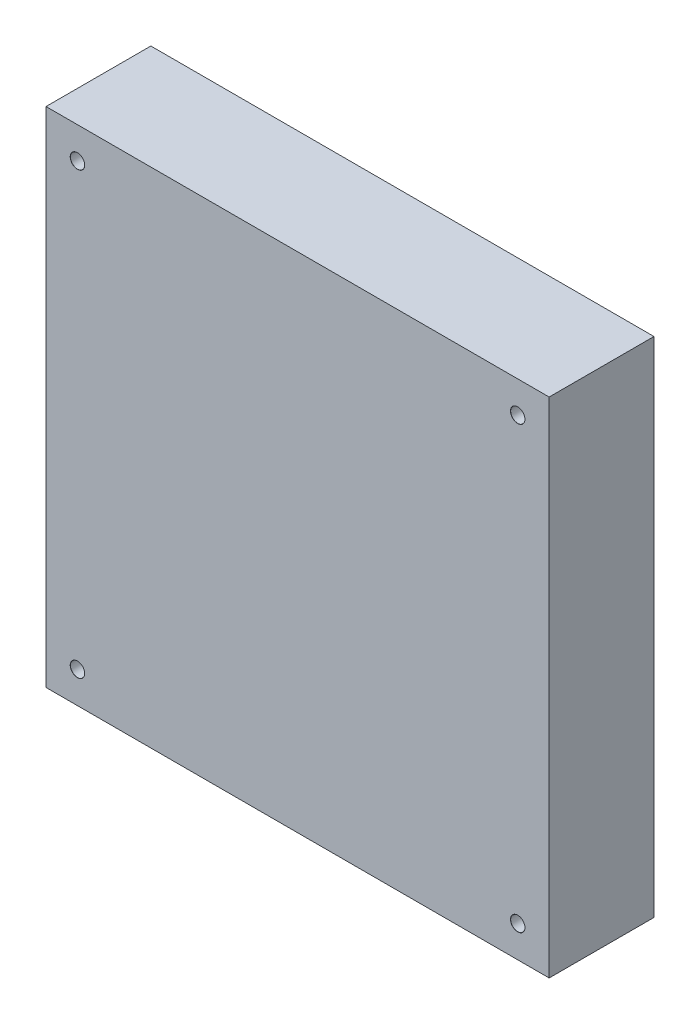
ISO-10303-21;
HEADER;
FILE_DESCRIPTION(('STEP AP214'),'2;1');
FILE_NAME('part.step','',(''),(''),'','','');
FILE_SCHEMA(('AUTOMOTIVE_DESIGN { 1 0 10303 214 1 1 1 1 }'));
ENDSEC;
DATA;
#1=APPLICATION_CONTEXT('core data for automotive mechanical design processes');
#2=APPLICATION_PROTOCOL_DEFINITION('international standard','automotive_design',2000,#1);
#3=PRODUCT_CONTEXT('',#1,'mechanical');
#4=PRODUCT('Part','Part','',(#3));
#5=PRODUCT_RELATED_PRODUCT_CATEGORY('part','',(#4));
#6=PRODUCT_DEFINITION_FORMATION('','',#4);
#7=PRODUCT_DEFINITION_CONTEXT('part definition',#1,'design');
#8=PRODUCT_DEFINITION('design','',#6,#7);
#9=PRODUCT_DEFINITION_SHAPE('','',#8);
#10=(LENGTH_UNIT() NAMED_UNIT(*) SI_UNIT(.MILLI.,.METRE.));
#11=(NAMED_UNIT(*) PLANE_ANGLE_UNIT() SI_UNIT($,.RADIAN.));
#12=(NAMED_UNIT(*) SI_UNIT($,.STERADIAN.) SOLID_ANGLE_UNIT());
#13=UNCERTAINTY_MEASURE_WITH_UNIT(LENGTH_MEASURE(1.E-05),#10,'distance_accuracy_value','');
#14=(GEOMETRIC_REPRESENTATION_CONTEXT(3) GLOBAL_UNCERTAINTY_ASSIGNED_CONTEXT((#13)) GLOBAL_UNIT_ASSIGNED_CONTEXT((#10,
#11,#12)) REPRESENTATION_CONTEXT('',''));
#15=CARTESIAN_POINT('',(0.,0.,0.));
#16=DIRECTION('',(0.,0.,1.));
#17=DIRECTION('',(1.,0.,0.));
#18=AXIS2_PLACEMENT_3D('',#15,#16,#17);
#19=CARTESIAN_POINT('',(60.,60.,25.));
#20=DIRECTION('',(-1.,0.,0.));
#21=DIRECTION('',(0.,-1.,0.));
#22=AXIS2_PLACEMENT_3D('',#19,#20,#21);
#23=PLANE('',#22);
#24=DIRECTION('',(0.,1.,0.));
#25=VECTOR('',#24,1.);
#26=CARTESIAN_POINT('',(60.,60.,0.));
#27=LINE('',#26,#25);
#28=CARTESIAN_POINT('',(60.,-60.,0.));
#29=VERTEX_POINT('',#28);
#30=CARTESIAN_POINT('',(60.,60.,0.));
#31=VERTEX_POINT('',#30);
#32=EDGE_CURVE('E106',#29,#31,#27,.T.);
#33=ORIENTED_EDGE('',*,*,#32,.T.);
#34=DIRECTION('',(0.,0.,-1.));
#35=VECTOR('',#34,1.);
#36=CARTESIAN_POINT('',(60.,60.,25.));
#37=LINE('',#36,#35);
#38=CARTESIAN_POINT('',(60.,60.,25.));
#39=VERTEX_POINT('',#38);
#40=EDGE_CURVE('E11',#39,#31,#37,.T.);
#41=ORIENTED_EDGE('',*,*,#40,.F.);
#42=DIRECTION('',(0.,1.,0.));
#43=VECTOR('',#42,1.);
#44=CARTESIAN_POINT('',(60.,60.,25.));
#45=LINE('',#44,#43);
#46=CARTESIAN_POINT('',(60.,-60.,25.));
#47=VERTEX_POINT('',#46);
#48=EDGE_CURVE('E94',#47,#39,#45,.T.);
#49=ORIENTED_EDGE('',*,*,#48,.F.);
#50=DIRECTION('',(0.,0.,-1.));
#51=VECTOR('',#50,1.);
#52=CARTESIAN_POINT('',(60.,-60.,25.));
#53=LINE('',#52,#51);
#54=EDGE_CURVE('E102',#47,#29,#53,.T.);
#55=ORIENTED_EDGE('',*,*,#54,.T.);
#56=EDGE_LOOP('',(#33,#41,#49,#55));
#57=FACE_BOUND('',#56,.T.);
#58=ADVANCED_FACE('F43',(#57),#23,.F.);
#59=CARTESIAN_POINT('',(-60.,60.,25.));
#60=DIRECTION('',(0.,-1.,0.));
#61=DIRECTION('',(0.,0.,-1.));
#62=AXIS2_PLACEMENT_3D('',#59,#60,#61);
#63=PLANE('',#62);
#64=DIRECTION('',(-1.,0.,0.));
#65=VECTOR('',#64,1.);
#66=CARTESIAN_POINT('',(-60.,60.,0.));
#67=LINE('',#66,#65);
#68=CARTESIAN_POINT('',(-60.,60.,0.));
#69=VERTEX_POINT('',#68);
#70=EDGE_CURVE('E98',#31,#69,#67,.T.);
#71=ORIENTED_EDGE('',*,*,#70,.T.);
#72=DIRECTION('',(0.,0.,-1.));
#73=VECTOR('',#72,1.);
#74=CARTESIAN_POINT('',(-60.,60.,25.));
#75=LINE('',#74,#73);
#76=CARTESIAN_POINT('',(-60.,60.,25.));
#77=VERTEX_POINT('',#76);
#78=EDGE_CURVE('E51',#77,#69,#75,.T.);
#79=ORIENTED_EDGE('',*,*,#78,.F.);
#80=DIRECTION('',(-1.,0.,0.));
#81=VECTOR('',#80,1.);
#82=CARTESIAN_POINT('',(-60.,60.,25.));
#83=LINE('',#82,#81);
#84=EDGE_CURVE('E89',#39,#77,#83,.T.);
#85=ORIENTED_EDGE('',*,*,#84,.F.);
#86=ORIENTED_EDGE('',*,*,#40,.T.);
#87=EDGE_LOOP('',(#71,#79,#85,#86));
#88=FACE_BOUND('',#87,.T.);
#89=ADVANCED_FACE('F97',(#88),#63,.F.);
#90=CARTESIAN_POINT('',(-60.,60.,25.));
#91=DIRECTION('',(1.,0.,0.));
#92=DIRECTION('',(0.,1.,0.));
#93=AXIS2_PLACEMENT_3D('',#90,#91,#92);
#94=PLANE('',#93);
#95=DIRECTION('',(0.,-1.,0.));
#96=VECTOR('',#95,1.);
#97=CARTESIAN_POINT('',(-60.,60.,0.));
#98=LINE('',#97,#96);
#99=CARTESIAN_POINT('',(-60.,-60.,0.));
#100=VERTEX_POINT('',#99);
#101=EDGE_CURVE('E76',#69,#100,#98,.T.);
#102=ORIENTED_EDGE('',*,*,#101,.T.);
#103=DIRECTION('',(0.,0.,-1.));
#104=VECTOR('',#103,1.);
#105=CARTESIAN_POINT('',(-60.,-60.,25.));
#106=LINE('',#105,#104);
#107=CARTESIAN_POINT('',(-60.,-60.,25.));
#108=VERTEX_POINT('',#107);
#109=EDGE_CURVE('E99',#108,#100,#106,.T.);
#110=ORIENTED_EDGE('',*,*,#109,.F.);
#111=DIRECTION('',(0.,-1.,0.));
#112=VECTOR('',#111,1.);
#113=CARTESIAN_POINT('',(-60.,60.,25.));
#114=LINE('',#113,#112);
#115=EDGE_CURVE('E92',#77,#108,#114,.T.);
#116=ORIENTED_EDGE('',*,*,#115,.F.);
#117=ORIENTED_EDGE('',*,*,#78,.T.);
#118=EDGE_LOOP('',(#102,#110,#116,#117));
#119=FACE_BOUND('',#118,.T.);
#120=ADVANCED_FACE('F100',(#119),#94,.F.);
#121=CARTESIAN_POINT('',(-60.,-60.,25.));
#122=DIRECTION('',(0.,1.,0.));
#123=DIRECTION('',(0.,0.,1.));
#124=AXIS2_PLACEMENT_3D('',#121,#122,#123);
#125=PLANE('',#124);
#126=DIRECTION('',(1.,0.,0.));
#127=VECTOR('',#126,1.);
#128=CARTESIAN_POINT('',(-60.,-60.,0.));
#129=LINE('',#128,#127);
#130=EDGE_CURVE('E82',#100,#29,#129,.T.);
#131=ORIENTED_EDGE('',*,*,#130,.T.);
#132=ORIENTED_EDGE('',*,*,#54,.F.);
#133=DIRECTION('',(1.,0.,0.));
#134=VECTOR('',#133,1.);
#135=CARTESIAN_POINT('',(-60.,-60.,25.));
#136=LINE('',#135,#134);
#137=EDGE_CURVE('E59',#108,#47,#136,.T.);
#138=ORIENTED_EDGE('',*,*,#137,.F.);
#139=ORIENTED_EDGE('',*,*,#109,.T.);
#140=EDGE_LOOP('',(#131,#132,#138,#139));
#141=FACE_BOUND('',#140,.T.);
#142=ADVANCED_FACE('F114',(#141),#125,.F.);
#143=CARTESIAN_POINT('',(0.,0.,25.));
#144=DIRECTION('',(0.,0.,1.));
#145=DIRECTION('',(1.,0.,0.));
#146=AXIS2_PLACEMENT_3D('',#143,#144,#145);
#147=PLANE('',#146);
#148=CARTESIAN_POINT('',(-52.5,52.5,25.));
#149=DIRECTION('',(0.,0.,1.));
#150=DIRECTION('',(1.,0.,0.));
#151=AXIS2_PLACEMENT_3D('',#148,#149,#150);
#152=CIRCLE('',#151,1.725);
#153=CARTESIAN_POINT('',(-50.775,52.5,25.));
#154=VERTEX_POINT('',#153);
#155=EDGE_CURVE('E152',#154,#154,#152,.T.);
#156=ORIENTED_EDGE('',*,*,#155,.F.);
#157=EDGE_LOOP('',(#156));
#158=FACE_BOUND('',#157,.T.);
#159=CARTESIAN_POINT('',(52.5,52.5,25.));
#160=DIRECTION('',(0.,0.,1.));
#161=DIRECTION('',(1.,0.,0.));
#162=AXIS2_PLACEMENT_3D('',#159,#160,#161);
#163=CIRCLE('',#162,1.725);
#164=CARTESIAN_POINT('',(54.225,52.5,25.));
#165=VERTEX_POINT('',#164);
#166=EDGE_CURVE('E143',#165,#165,#163,.T.);
#167=ORIENTED_EDGE('',*,*,#166,.F.);
#168=EDGE_LOOP('',(#167));
#169=FACE_BOUND('',#168,.T.);
#170=CARTESIAN_POINT('',(52.5,-52.5,25.));
#171=DIRECTION('',(0.,0.,1.));
#172=DIRECTION('',(1.,0.,0.));
#173=AXIS2_PLACEMENT_3D('',#170,#171,#172);
#174=CIRCLE('',#173,1.725);
#175=CARTESIAN_POINT('',(54.225,-52.5,25.));
#176=VERTEX_POINT('',#175);
#177=EDGE_CURVE('E134',#176,#176,#174,.T.);
#178=ORIENTED_EDGE('',*,*,#177,.F.);
#179=EDGE_LOOP('',(#178));
#180=FACE_BOUND('',#179,.T.);
#181=CARTESIAN_POINT('',(-52.5,-52.5,25.));
#182=DIRECTION('',(0.,0.,1.));
#183=DIRECTION('',(1.,0.,0.));
#184=AXIS2_PLACEMENT_3D('',#181,#182,#183);
#185=CIRCLE('',#184,1.725);
#186=CARTESIAN_POINT('',(-50.775,-52.5,25.));
#187=VERTEX_POINT('',#186);
#188=EDGE_CURVE('E125',#187,#187,#185,.T.);
#189=ORIENTED_EDGE('',*,*,#188,.F.);
#190=EDGE_LOOP('',(#189));
#191=FACE_BOUND('',#190,.T.);
#192=ORIENTED_EDGE('',*,*,#48,.T.);
#193=ORIENTED_EDGE('',*,*,#84,.T.);
#194=ORIENTED_EDGE('',*,*,#115,.T.);
#195=ORIENTED_EDGE('',*,*,#137,.T.);
#196=EDGE_LOOP('',(#192,#193,#194,#195));
#197=FACE_BOUND('',#196,.T.);
#198=ADVANCED_FACE('F90',(#158,#169,#180,#191,#197),#147,.T.);
#199=CARTESIAN_POINT('',(0.,0.,0.));
#200=DIRECTION('',(0.,0.,1.));
#201=DIRECTION('',(1.,0.,0.));
#202=AXIS2_PLACEMENT_3D('',#199,#200,#201);
#203=PLANE('',#202);
#204=CARTESIAN_POINT('',(-52.5,52.5,0.));
#205=DIRECTION('',(0.,0.,1.));
#206=DIRECTION('',(1.,0.,0.));
#207=AXIS2_PLACEMENT_3D('',#204,#205,#206);
#208=CIRCLE('',#207,1.7);
#209=CARTESIAN_POINT('',(-50.8,52.5,0.));
#210=VERTEX_POINT('',#209);
#211=EDGE_CURVE('E146',#210,#210,#208,.T.);
#212=ORIENTED_EDGE('',*,*,#211,.T.);
#213=EDGE_LOOP('',(#212));
#214=FACE_BOUND('',#213,.T.);
#215=CARTESIAN_POINT('',(52.5,52.5,0.));
#216=DIRECTION('',(0.,0.,1.));
#217=DIRECTION('',(1.,0.,0.));
#218=AXIS2_PLACEMENT_3D('',#215,#216,#217);
#219=CIRCLE('',#218,1.7);
#220=CARTESIAN_POINT('',(54.2,52.5,0.));
#221=VERTEX_POINT('',#220);
#222=EDGE_CURVE('E137',#221,#221,#219,.T.);
#223=ORIENTED_EDGE('',*,*,#222,.T.);
#224=EDGE_LOOP('',(#223));
#225=FACE_BOUND('',#224,.T.);
#226=CARTESIAN_POINT('',(52.5,-52.5,0.));
#227=DIRECTION('',(0.,0.,1.));
#228=DIRECTION('',(1.,0.,0.));
#229=AXIS2_PLACEMENT_3D('',#226,#227,#228);
#230=CIRCLE('',#229,1.7);
#231=CARTESIAN_POINT('',(54.2,-52.5,0.));
#232=VERTEX_POINT('',#231);
#233=EDGE_CURVE('E128',#232,#232,#230,.T.);
#234=ORIENTED_EDGE('',*,*,#233,.T.);
#235=EDGE_LOOP('',(#234));
#236=FACE_BOUND('',#235,.T.);
#237=CARTESIAN_POINT('',(-52.5,-52.5,0.));
#238=DIRECTION('',(0.,0.,1.));
#239=DIRECTION('',(1.,0.,0.));
#240=AXIS2_PLACEMENT_3D('',#237,#238,#239);
#241=CIRCLE('',#240,1.7);
#242=CARTESIAN_POINT('',(-50.8,-52.5,0.));
#243=VERTEX_POINT('',#242);
#244=EDGE_CURVE('E109',#243,#243,#241,.T.);
#245=ORIENTED_EDGE('',*,*,#244,.T.);
#246=EDGE_LOOP('',(#245));
#247=FACE_BOUND('',#246,.T.);
#248=ORIENTED_EDGE('',*,*,#32,.F.);
#249=ORIENTED_EDGE('',*,*,#130,.F.);
#250=ORIENTED_EDGE('',*,*,#101,.F.);
#251=ORIENTED_EDGE('',*,*,#70,.F.);
#252=EDGE_LOOP('',(#248,#249,#250,#251));
#253=FACE_BOUND('',#252,.T.);
#254=ADVANCED_FACE('F117',(#214,#225,#236,#247,#253),#203,.F.);
#255=CARTESIAN_POINT('',(-52.5,-52.5,25.));
#256=DIRECTION('',(0.,0.,1.));
#257=DIRECTION('',(1.,0.,0.));
#258=AXIS2_PLACEMENT_3D('',#255,#256,#257);
#259=CYLINDRICAL_SURFACE('',#258,1.7);
#260=ORIENTED_EDGE('',*,*,#244,.F.);
#261=EDGE_LOOP('',(#260));
#262=FACE_BOUND('',#261,.T.);
#263=CARTESIAN_POINT('',(-52.5,-52.5,24.9790225092206));
#264=DIRECTION('',(0.,0.,1.));
#265=DIRECTION('',(1.,0.,0.));
#266=AXIS2_PLACEMENT_3D('',#263,#264,#265);
#267=CIRCLE('',#266,1.7);
#268=CARTESIAN_POINT('',(-50.8,-52.5,24.9790225092206));
#269=VERTEX_POINT('',#268);
#270=EDGE_CURVE('E122',#269,#269,#267,.T.);
#271=ORIENTED_EDGE('',*,*,#270,.T.);
#272=EDGE_LOOP('',(#271));
#273=FACE_BOUND('',#272,.T.);
#274=ADVANCED_FACE('F170',(#262,#273),#259,.F.);
#275=CARTESIAN_POINT('',(-52.5,-52.5,25.));
#276=DIRECTION('',(0.,0.,1.));
#277=DIRECTION('',(1.,0.,0.));
#278=AXIS2_PLACEMENT_3D('',#275,#276,#277);
#279=CONICAL_SURFACE('',#278,1.725,0.87266462599709);
#280=ORIENTED_EDGE('',*,*,#270,.F.);
#281=EDGE_LOOP('',(#280));
#282=FACE_BOUND('',#281,.T.);
#283=ORIENTED_EDGE('',*,*,#188,.T.);
#284=EDGE_LOOP('',(#283));
#285=FACE_BOUND('',#284,.T.);
#286=ADVANCED_FACE('F167',(#282,#285),#279,.F.);
#287=CARTESIAN_POINT('',(52.5,-52.5,25.));
#288=DIRECTION('',(0.,0.,1.));
#289=DIRECTION('',(1.,0.,0.));
#290=AXIS2_PLACEMENT_3D('',#287,#288,#289);
#291=CYLINDRICAL_SURFACE('',#290,1.7);
#292=ORIENTED_EDGE('',*,*,#233,.F.);
#293=EDGE_LOOP('',(#292));
#294=FACE_BOUND('',#293,.T.);
#295=CARTESIAN_POINT('',(52.5,-52.5,24.9790225092206));
#296=DIRECTION('',(0.,0.,1.));
#297=DIRECTION('',(1.,0.,0.));
#298=AXIS2_PLACEMENT_3D('',#295,#296,#297);
#299=CIRCLE('',#298,1.7);
#300=CARTESIAN_POINT('',(54.2,-52.5,24.9790225092206));
#301=VERTEX_POINT('',#300);
#302=EDGE_CURVE('E131',#301,#301,#299,.T.);
#303=ORIENTED_EDGE('',*,*,#302,.T.);
#304=EDGE_LOOP('',(#303));
#305=FACE_BOUND('',#304,.T.);
#306=ADVANCED_FACE('F169',(#294,#305),#291,.F.);
#307=CARTESIAN_POINT('',(52.5,-52.5,25.));
#308=DIRECTION('',(0.,0.,1.));
#309=DIRECTION('',(1.,0.,0.));
#310=AXIS2_PLACEMENT_3D('',#307,#308,#309);
#311=CONICAL_SURFACE('',#310,1.725,0.87266462599709);
#312=ORIENTED_EDGE('',*,*,#302,.F.);
#313=EDGE_LOOP('',(#312));
#314=FACE_BOUND('',#313,.T.);
#315=ORIENTED_EDGE('',*,*,#177,.T.);
#316=EDGE_LOOP('',(#315));
#317=FACE_BOUND('',#316,.T.);
#318=ADVANCED_FACE('F177',(#314,#317),#311,.F.);
#319=CARTESIAN_POINT('',(52.5,52.5,25.));
#320=DIRECTION('',(0.,0.,1.));
#321=DIRECTION('',(1.,0.,0.));
#322=AXIS2_PLACEMENT_3D('',#319,#320,#321);
#323=CYLINDRICAL_SURFACE('',#322,1.7);
#324=ORIENTED_EDGE('',*,*,#222,.F.);
#325=EDGE_LOOP('',(#324));
#326=FACE_BOUND('',#325,.T.);
#327=CARTESIAN_POINT('',(52.5,52.5,24.9790225092206));
#328=DIRECTION('',(0.,0.,1.));
#329=DIRECTION('',(1.,0.,0.));
#330=AXIS2_PLACEMENT_3D('',#327,#328,#329);
#331=CIRCLE('',#330,1.7);
#332=CARTESIAN_POINT('',(54.2,52.5,24.9790225092206));
#333=VERTEX_POINT('',#332);
#334=EDGE_CURVE('E140',#333,#333,#331,.T.);
#335=ORIENTED_EDGE('',*,*,#334,.T.);
#336=EDGE_LOOP('',(#335));
#337=FACE_BOUND('',#336,.T.);
#338=ADVANCED_FACE('F211',(#326,#337),#323,.F.);
#339=CARTESIAN_POINT('',(52.5,52.5,25.));
#340=DIRECTION('',(0.,0.,1.));
#341=DIRECTION('',(1.,0.,0.));
#342=AXIS2_PLACEMENT_3D('',#339,#340,#341);
#343=CONICAL_SURFACE('',#342,1.725,0.87266462599709);
#344=ORIENTED_EDGE('',*,*,#334,.F.);
#345=EDGE_LOOP('',(#344));
#346=FACE_BOUND('',#345,.T.);
#347=ORIENTED_EDGE('',*,*,#166,.T.);
#348=EDGE_LOOP('',(#347));
#349=FACE_BOUND('',#348,.T.);
#350=ADVANCED_FACE('F216',(#346,#349),#343,.F.);
#351=CARTESIAN_POINT('',(-52.5,52.5,25.));
#352=DIRECTION('',(0.,0.,1.));
#353=DIRECTION('',(1.,0.,0.));
#354=AXIS2_PLACEMENT_3D('',#351,#352,#353);
#355=CYLINDRICAL_SURFACE('',#354,1.7);
#356=ORIENTED_EDGE('',*,*,#211,.F.);
#357=EDGE_LOOP('',(#356));
#358=FACE_BOUND('',#357,.T.);
#359=CARTESIAN_POINT('',(-52.5,52.5,24.9790225092206));
#360=DIRECTION('',(0.,0.,1.));
#361=DIRECTION('',(1.,0.,0.));
#362=AXIS2_PLACEMENT_3D('',#359,#360,#361);
#363=CIRCLE('',#362,1.7);
#364=CARTESIAN_POINT('',(-50.8,52.5,24.9790225092206));
#365=VERTEX_POINT('',#364);
#366=EDGE_CURVE('E149',#365,#365,#363,.T.);
#367=ORIENTED_EDGE('',*,*,#366,.T.);
#368=EDGE_LOOP('',(#367));
#369=FACE_BOUND('',#368,.T.);
#370=ADVANCED_FACE('F222',(#358,#369),#355,.F.);
#371=CARTESIAN_POINT('',(-52.5,52.5,25.));
#372=DIRECTION('',(0.,0.,1.));
#373=DIRECTION('',(1.,0.,0.));
#374=AXIS2_PLACEMENT_3D('',#371,#372,#373);
#375=CONICAL_SURFACE('',#374,1.725,0.87266462599709);
#376=ORIENTED_EDGE('',*,*,#366,.F.);
#377=EDGE_LOOP('',(#376));
#378=FACE_BOUND('',#377,.T.);
#379=ORIENTED_EDGE('',*,*,#155,.T.);
#380=EDGE_LOOP('',(#379));
#381=FACE_BOUND('',#380,.T.);
#382=ADVANCED_FACE('F156',(#378,#381),#375,.F.);
#383=CLOSED_SHELL('',(#58,#89,#120,#142,#198,#254,#274,#286,#306,#318,#338,#350,#370,#382));
#384=MANIFOLD_SOLID_BREP('B2',#383);
#385=ADVANCED_BREP_SHAPE_REPRESENTATION('',(#18,#384),#14);
#386=SHAPE_DEFINITION_REPRESENTATION(#9,#385);
ENDSEC;
END-ISO-10303-21;
